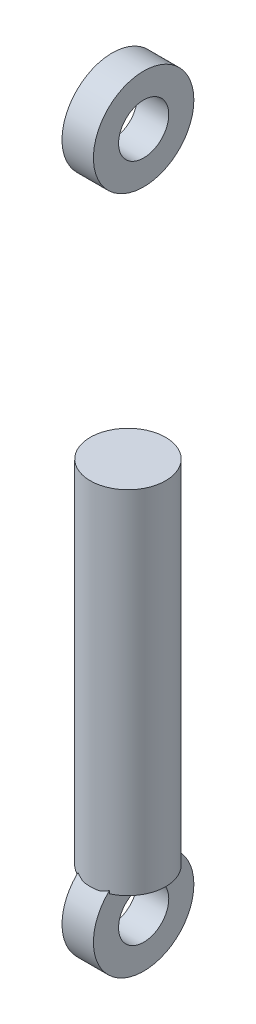
ISO-10303-21;
HEADER;
FILE_DESCRIPTION(('STEP AP214'),'2;1');
FILE_NAME('part.step','',(''),(''),'','','');
FILE_SCHEMA(('AUTOMOTIVE_DESIGN { 1 0 10303 214 1 1 1 1 }'));
ENDSEC;
DATA;
#1=APPLICATION_CONTEXT('core data for automotive mechanical design processes');
#2=APPLICATION_PROTOCOL_DEFINITION('international standard','automotive_design',2000,#1);
#3=PRODUCT_CONTEXT('',#1,'mechanical');
#4=PRODUCT('Part','Part','',(#3));
#5=PRODUCT_RELATED_PRODUCT_CATEGORY('part','',(#4));
#6=PRODUCT_DEFINITION_FORMATION('','',#4);
#7=PRODUCT_DEFINITION_CONTEXT('part definition',#1,'design');
#8=PRODUCT_DEFINITION('design','',#6,#7);
#9=PRODUCT_DEFINITION_SHAPE('','',#8);
#10=(LENGTH_UNIT() NAMED_UNIT(*) SI_UNIT(.MILLI.,.METRE.));
#11=(NAMED_UNIT(*) PLANE_ANGLE_UNIT() SI_UNIT($,.RADIAN.));
#12=(NAMED_UNIT(*) SI_UNIT($,.STERADIAN.) SOLID_ANGLE_UNIT());
#13=UNCERTAINTY_MEASURE_WITH_UNIT(LENGTH_MEASURE(1.E-05),#10,'distance_accuracy_value','');
#14=(GEOMETRIC_REPRESENTATION_CONTEXT(3) GLOBAL_UNCERTAINTY_ASSIGNED_CONTEXT((#13)) GLOBAL_UNIT_ASSIGNED_CONTEXT((#10,
#11,#12)) REPRESENTATION_CONTEXT('',''));
#15=CARTESIAN_POINT('',(0.,0.,0.));
#16=DIRECTION('',(0.,0.,1.));
#17=DIRECTION('',(1.,0.,0.));
#18=AXIS2_PLACEMENT_3D('',#15,#16,#17);
#19=CARTESIAN_POINT('',(1.5875,-3.44045519976716,0.));
#20=DIRECTION('',(1.,0.,0.));
#21=DIRECTION('',(0.,0.,-1.));
#22=AXIS2_PLACEMENT_3D('',#19,#20,#21);
#23=PLANE('',#22);
#24=CARTESIAN_POINT('',(1.5875,-3.44045519976716,0.));
#25=DIRECTION('',(1.,0.,0.));
#26=DIRECTION('',(0.,0.,-1.));
#27=AXIS2_PLACEMENT_3D('',#24,#25,#26);
#28=CIRCLE('',#27,5.08);
#29=CARTESIAN_POINT('',(1.5875,-3.44045519976716,-5.08));
#30=VERTEX_POINT('',#29);
#31=EDGE_CURVE('E12',#30,#30,#28,.T.);
#32=ORIENTED_EDGE('',*,*,#31,.T.);
#33=EDGE_LOOP('',(#32));
#34=FACE_BOUND('',#33,.T.);
#35=CARTESIAN_POINT('',(1.5875,-3.44045519976716,0.));
#36=DIRECTION('',(1.,0.,0.));
#37=DIRECTION('',(0.,0.,-1.));
#38=AXIS2_PLACEMENT_3D('',#35,#36,#37);
#39=CIRCLE('',#38,2.54);
#40=CARTESIAN_POINT('',(1.5875,-3.44045519976716,-2.54));
#41=VERTEX_POINT('',#40);
#42=EDGE_CURVE('E61',#41,#41,#39,.T.);
#43=ORIENTED_EDGE('',*,*,#42,.F.);
#44=EDGE_LOOP('',(#43));
#45=FACE_BOUND('',#44,.T.);
#46=ADVANCED_FACE('F50',(#34,#45),#23,.T.);
#47=CARTESIAN_POINT('',(-1.5875,-3.44045519976716,0.));
#48=DIRECTION('',(1.,0.,0.));
#49=DIRECTION('',(0.,0.,-1.));
#50=AXIS2_PLACEMENT_3D('',#47,#48,#49);
#51=PLANE('',#50);
#52=CARTESIAN_POINT('',(-1.5875,-3.44045519976716,0.));
#53=DIRECTION('',(1.,0.,0.));
#54=DIRECTION('',(0.,0.,-1.));
#55=AXIS2_PLACEMENT_3D('',#52,#53,#54);
#56=CIRCLE('',#55,5.08);
#57=CARTESIAN_POINT('',(-1.5875,-3.44045519976716,-5.08));
#58=VERTEX_POINT('',#57);
#59=EDGE_CURVE('E54',#58,#58,#56,.T.);
#60=ORIENTED_EDGE('',*,*,#59,.F.);
#61=EDGE_LOOP('',(#60));
#62=FACE_BOUND('',#61,.T.);
#63=CARTESIAN_POINT('',(-1.5875,-3.44045519976716,0.));
#64=DIRECTION('',(1.,0.,0.));
#65=DIRECTION('',(0.,0.,-1.));
#66=AXIS2_PLACEMENT_3D('',#63,#64,#65);
#67=CIRCLE('',#66,2.54);
#68=CARTESIAN_POINT('',(-1.5875,-3.44045519976716,-2.54));
#69=VERTEX_POINT('',#68);
#70=EDGE_CURVE('E63',#69,#69,#67,.T.);
#71=ORIENTED_EDGE('',*,*,#70,.T.);
#72=EDGE_LOOP('',(#71));
#73=FACE_BOUND('',#72,.T.);
#74=ADVANCED_FACE('F73',(#62,#73),#51,.F.);
#75=CARTESIAN_POINT('',(1.5875,-3.44045519976716,0.));
#76=DIRECTION('',(-1.,0.,0.));
#77=DIRECTION('',(0.,0.,1.));
#78=AXIS2_PLACEMENT_3D('',#75,#76,#77);
#79=CYLINDRICAL_SURFACE('',#78,5.08);
#80=ORIENTED_EDGE('',*,*,#31,.F.);
#81=EDGE_LOOP('',(#80));
#82=FACE_BOUND('',#81,.T.);
#83=ORIENTED_EDGE('',*,*,#59,.T.);
#84=EDGE_LOOP('',(#83));
#85=FACE_BOUND('',#84,.T.);
#86=ADVANCED_FACE('F52',(#82,#85),#79,.T.);
#87=CARTESIAN_POINT('',(1.5875,-3.44045519976716,0.));
#88=DIRECTION('',(-1.,0.,0.));
#89=DIRECTION('',(0.,0.,1.));
#90=AXIS2_PLACEMENT_3D('',#87,#88,#89);
#91=CYLINDRICAL_SURFACE('',#90,2.54);
#92=ORIENTED_EDGE('',*,*,#42,.T.);
#93=EDGE_LOOP('',(#92));
#94=FACE_BOUND('',#93,.T.);
#95=ORIENTED_EDGE('',*,*,#70,.F.);
#96=EDGE_LOOP('',(#95));
#97=FACE_BOUND('',#96,.T.);
#98=ADVANCED_FACE('F69',(#94,#97),#91,.F.);
#99=CLOSED_SHELL('',(#46,#74,#86,#98));
#100=MANIFOLD_SOLID_BREP('B2',#99);
#101=CARTESIAN_POINT('',(1.5875,65.2665448002329,0.));
#102=DIRECTION('',(1.,0.,0.));
#103=DIRECTION('',(0.,0.,-1.));
#104=AXIS2_PLACEMENT_3D('',#101,#102,#103);
#105=PLANE('',#104);
#106=CARTESIAN_POINT('',(1.5875,65.2665448002329,0.));
#107=DIRECTION('',(1.,0.,0.));
#108=DIRECTION('',(0.,0.,-1.));
#109=AXIS2_PLACEMENT_3D('',#106,#107,#108);
#110=CIRCLE('',#109,5.07999999999999);
#111=CARTESIAN_POINT('',(1.5875,65.2665448002329,-5.07999999999999));
#112=VERTEX_POINT('',#111);
#113=EDGE_CURVE('E49',#112,#112,#110,.T.);
#114=ORIENTED_EDGE('',*,*,#113,.T.);
#115=EDGE_LOOP('',(#114));
#116=FACE_BOUND('',#115,.T.);
#117=CARTESIAN_POINT('',(1.5875,65.2665448002329,0.));
#118=DIRECTION('',(1.,0.,0.));
#119=DIRECTION('',(0.,0.,-1.));
#120=AXIS2_PLACEMENT_3D('',#117,#118,#119);
#121=CIRCLE('',#120,2.54);
#122=CARTESIAN_POINT('',(1.5875,65.2665448002329,-2.54));
#123=VERTEX_POINT('',#122);
#124=EDGE_CURVE('E130',#123,#123,#121,.T.);
#125=ORIENTED_EDGE('',*,*,#124,.F.);
#126=EDGE_LOOP('',(#125));
#127=FACE_BOUND('',#126,.T.);
#128=ADVANCED_FACE('F119',(#116,#127),#105,.T.);
#129=CARTESIAN_POINT('',(-1.5875,65.2665448002329,0.));
#130=DIRECTION('',(1.,0.,0.));
#131=DIRECTION('',(0.,0.,-1.));
#132=AXIS2_PLACEMENT_3D('',#129,#130,#131);
#133=PLANE('',#132);
#134=CARTESIAN_POINT('',(-1.5875,65.2665448002329,0.));
#135=DIRECTION('',(1.,0.,0.));
#136=DIRECTION('',(0.,0.,-1.));
#137=AXIS2_PLACEMENT_3D('',#134,#135,#136);
#138=CIRCLE('',#137,5.07999999999999);
#139=CARTESIAN_POINT('',(-1.5875,65.2665448002329,-5.07999999999999));
#140=VERTEX_POINT('',#139);
#141=EDGE_CURVE('E123',#140,#140,#138,.T.);
#142=ORIENTED_EDGE('',*,*,#141,.F.);
#143=EDGE_LOOP('',(#142));
#144=FACE_BOUND('',#143,.T.);
#145=CARTESIAN_POINT('',(-1.5875,65.2665448002329,0.));
#146=DIRECTION('',(1.,0.,0.));
#147=DIRECTION('',(0.,0.,-1.));
#148=AXIS2_PLACEMENT_3D('',#145,#146,#147);
#149=CIRCLE('',#148,2.54);
#150=CARTESIAN_POINT('',(-1.5875,65.2665448002329,-2.54));
#151=VERTEX_POINT('',#150);
#152=EDGE_CURVE('E132',#151,#151,#149,.T.);
#153=ORIENTED_EDGE('',*,*,#152,.T.);
#154=EDGE_LOOP('',(#153));
#155=FACE_BOUND('',#154,.T.);
#156=ADVANCED_FACE('F142',(#144,#155),#133,.F.);
#157=CARTESIAN_POINT('',(1.5875,65.2665448002329,0.));
#158=DIRECTION('',(-1.,0.,0.));
#159=DIRECTION('',(0.,0.,1.));
#160=AXIS2_PLACEMENT_3D('',#157,#158,#159);
#161=CYLINDRICAL_SURFACE('',#160,5.07999999999999);
#162=ORIENTED_EDGE('',*,*,#113,.F.);
#163=EDGE_LOOP('',(#162));
#164=FACE_BOUND('',#163,.T.);
#165=ORIENTED_EDGE('',*,*,#141,.T.);
#166=EDGE_LOOP('',(#165));
#167=FACE_BOUND('',#166,.T.);
#168=ADVANCED_FACE('F121',(#164,#167),#161,.T.);
#169=CARTESIAN_POINT('',(1.5875,65.2665448002329,0.));
#170=DIRECTION('',(-1.,0.,0.));
#171=DIRECTION('',(0.,0.,1.));
#172=AXIS2_PLACEMENT_3D('',#169,#170,#171);
#173=CYLINDRICAL_SURFACE('',#172,2.54);
#174=ORIENTED_EDGE('',*,*,#124,.T.);
#175=EDGE_LOOP('',(#174));
#176=FACE_BOUND('',#175,.T.);
#177=ORIENTED_EDGE('',*,*,#152,.F.);
#178=EDGE_LOOP('',(#177));
#179=FACE_BOUND('',#178,.T.);
#180=ADVANCED_FACE('F138',(#176,#179),#173,.F.);
#181=CLOSED_SHELL('',(#128,#156,#168,#180));
#182=MANIFOLD_SOLID_BREP('B7',#181);
#183=CARTESIAN_POINT('',(0.,35.56,0.));
#184=DIRECTION('',(0.,-1.,0.));
#185=DIRECTION('',(0.,0.,-1.));
#186=AXIS2_PLACEMENT_3D('',#183,#184,#185);
#187=CYLINDRICAL_SURFACE('',#186,3.81);
#188=CARTESIAN_POINT('',(0.,35.56,0.));
#189=DIRECTION('',(0.,1.,0.));
#190=DIRECTION('',(0.,0.,1.));
#191=AXIS2_PLACEMENT_3D('',#188,#189,#190);
#192=CIRCLE('',#191,3.81);
#193=CARTESIAN_POINT('',(0.,35.56,3.81));
#194=VERTEX_POINT('',#193);
#195=EDGE_CURVE('E118',#194,#194,#192,.T.);
#196=ORIENTED_EDGE('',*,*,#195,.F.);
#197=EDGE_LOOP('',(#196));
#198=FACE_BOUND('',#197,.T.);
#199=CARTESIAN_POINT('',(0.,0.,0.));
#200=DIRECTION('',(0.,1.,0.));
#201=DIRECTION('',(0.,0.,1.));
#202=AXIS2_PLACEMENT_3D('',#199,#200,#201);
#203=CIRCLE('',#202,3.81);
#204=CARTESIAN_POINT('',(0.,0.,3.81));
#205=VERTEX_POINT('',#204);
#206=EDGE_CURVE('E184',#205,#205,#203,.T.);
#207=ORIENTED_EDGE('',*,*,#206,.T.);
#208=EDGE_LOOP('',(#207));
#209=FACE_BOUND('',#208,.T.);
#210=ADVANCED_FACE('F181',(#198,#209),#187,.T.);
#211=CARTESIAN_POINT('',(0.,35.56,0.));
#212=DIRECTION('',(0.,1.,0.));
#213=DIRECTION('',(0.,0.,1.));
#214=AXIS2_PLACEMENT_3D('',#211,#212,#213);
#215=PLANE('',#214);
#216=ORIENTED_EDGE('',*,*,#195,.T.);
#217=EDGE_LOOP('',(#216));
#218=FACE_BOUND('',#217,.T.);
#219=ADVANCED_FACE('F196',(#218),#215,.T.);
#220=CARTESIAN_POINT('',(0.,0.,0.));
#221=DIRECTION('',(0.,1.,0.));
#222=DIRECTION('',(0.,0.,1.));
#223=AXIS2_PLACEMENT_3D('',#220,#221,#222);
#224=PLANE('',#223);
#225=ORIENTED_EDGE('',*,*,#206,.F.);
#226=EDGE_LOOP('',(#225));
#227=FACE_BOUND('',#226,.T.);
#228=ADVANCED_FACE('F194',(#227),#224,.F.);
#229=CLOSED_SHELL('',(#210,#219,#228));
#230=MANIFOLD_SOLID_BREP('B44',#229);
#231=ADVANCED_BREP_SHAPE_REPRESENTATION('',(#18,#100,#182,#230),#14);
#232=SHAPE_DEFINITION_REPRESENTATION(#9,#231);
ENDSEC;
END-ISO-10303-21;
